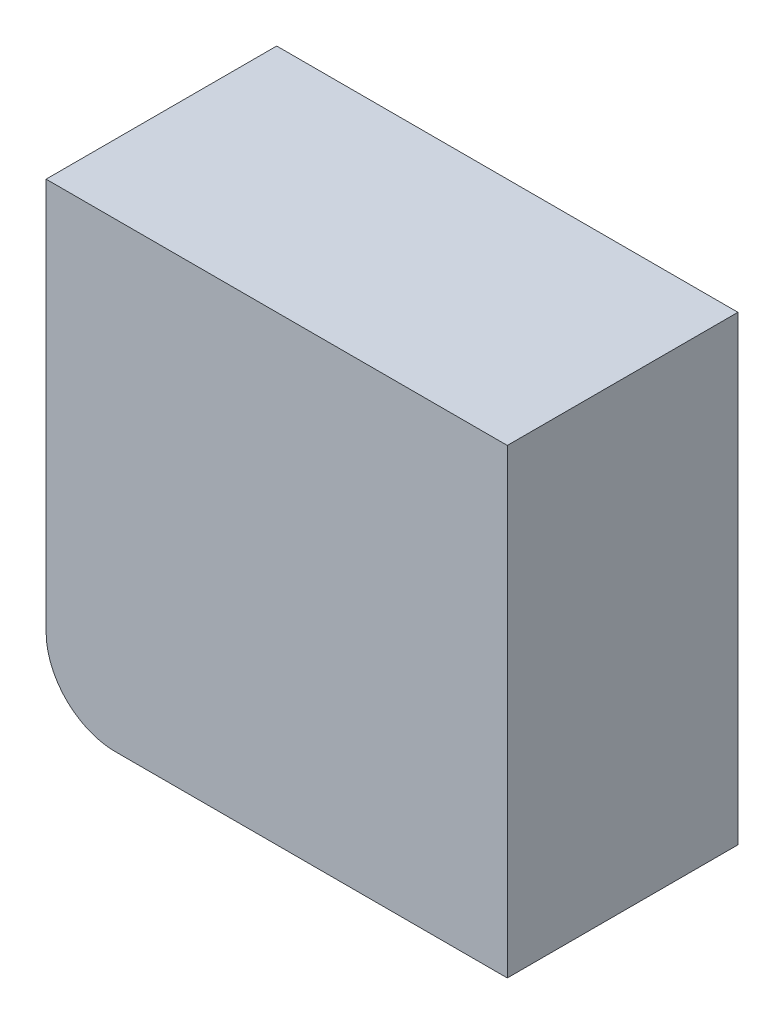
ISO-10303-21;
HEADER;
FILE_DESCRIPTION(('STEP AP214'),'2;1');
FILE_NAME('part.step','',(''),(''),'','','');
FILE_SCHEMA(('AUTOMOTIVE_DESIGN { 1 0 10303 214 1 1 1 1 }'));
ENDSEC;
DATA;
#1=APPLICATION_CONTEXT('core data for automotive mechanical design processes');
#2=APPLICATION_PROTOCOL_DEFINITION('international standard','automotive_design',2000,#1);
#3=PRODUCT_CONTEXT('',#1,'mechanical');
#4=PRODUCT('Part','Part','',(#3));
#5=PRODUCT_RELATED_PRODUCT_CATEGORY('part','',(#4));
#6=PRODUCT_DEFINITION_FORMATION('','',#4);
#7=PRODUCT_DEFINITION_CONTEXT('part definition',#1,'design');
#8=PRODUCT_DEFINITION('design','',#6,#7);
#9=PRODUCT_DEFINITION_SHAPE('','',#8);
#10=(LENGTH_UNIT() NAMED_UNIT(*) SI_UNIT(.MILLI.,.METRE.));
#11=(NAMED_UNIT(*) PLANE_ANGLE_UNIT() SI_UNIT($,.RADIAN.));
#12=(NAMED_UNIT(*) SI_UNIT($,.STERADIAN.) SOLID_ANGLE_UNIT());
#13=UNCERTAINTY_MEASURE_WITH_UNIT(LENGTH_MEASURE(1.E-05),#10,'distance_accuracy_value','');
#14=(GEOMETRIC_REPRESENTATION_CONTEXT(3) GLOBAL_UNCERTAINTY_ASSIGNED_CONTEXT((#13)) GLOBAL_UNIT_ASSIGNED_CONTEXT((#10,
#11,#12)) REPRESENTATION_CONTEXT('',''));
#15=CARTESIAN_POINT('',(0.,0.,0.));
#16=DIRECTION('',(0.,0.,1.));
#17=DIRECTION('',(1.,0.,0.));
#18=AXIS2_PLACEMENT_3D('',#15,#16,#17);
#19=CARTESIAN_POINT('',(0.,0.,10.));
#20=DIRECTION('',(1.,0.,0.));
#21=DIRECTION('',(0.,0.,-1.));
#22=AXIS2_PLACEMENT_3D('',#19,#20,#21);
#23=PLANE('',#22);
#24=DIRECTION('',(0.,-1.,0.));
#25=VECTOR('',#24,1.);
#26=CARTESIAN_POINT('',(0.,0.,0.));
#27=LINE('',#26,#25);
#28=CARTESIAN_POINT('',(0.,20.,0.));
#29=VERTEX_POINT('',#28);
#30=CARTESIAN_POINT('',(0.,5.,0.));
#31=VERTEX_POINT('',#30);
#32=EDGE_CURVE('E129',#29,#31,#27,.T.);
#33=ORIENTED_EDGE('',*,*,#32,.T.);
#34=CARTESIAN_POINT('',(0.,0.,25.));
#35=CARTESIAN_POINT('',(0.,1.,20.));
#36=CARTESIAN_POINT('',(0.,2.,15.));
#37=CARTESIAN_POINT('',(0.,3.,10.));
#38=CARTESIAN_POINT('',(0.,3.66666666666667,6.66666666666667));
#39=CARTESIAN_POINT('',(0.,4.33333333333333,3.33333333333333));
#40=CARTESIAN_POINT('',(0.,5.,0.));
#41=CARTESIAN_POINT('',(0.,6.33333333333333,-6.66666666666667));
#42=CARTESIAN_POINT('',(0.,7.66666666666667,-13.3333333333333));
#43=CARTESIAN_POINT('',(0.,9.,-20.));
#44=(BOUNDED_CURVE() B_SPLINE_CURVE(3,(#34,#35,#36,#37,#38,#39,#40,#41,#42,#43),.UNSPECIFIED.,
.F.,.F.) B_SPLINE_CURVE_WITH_KNOTS((4,3,3,4),(-0.015,0.,0.01,0.03),
.UNSPECIFIED.) CURVE() GEOMETRIC_REPRESENTATION_ITEM() RATIONAL_B_SPLINE_CURVE((1.,1.,1.,1.,1.,
1.,1.,1.,1.,1.)) REPRESENTATION_ITEM(''));
#45=CARTESIAN_POINT('',(0.,3.,10.));
#46=VERTEX_POINT('',#45);
#47=EDGE_CURVE('E63',#31,#46,#44,.F.);
#48=ORIENTED_EDGE('',*,*,#47,.T.);
#49=DIRECTION('',(0.,-1.,0.));
#50=VECTOR('',#49,1.);
#51=CARTESIAN_POINT('',(0.,0.,10.));
#52=LINE('',#51,#50);
#53=CARTESIAN_POINT('',(0.,20.,10.));
#54=VERTEX_POINT('',#53);
#55=EDGE_CURVE('E108',#54,#46,#52,.T.);
#56=ORIENTED_EDGE('',*,*,#55,.F.);
#57=DIRECTION('',(0.,0.,-1.));
#58=VECTOR('',#57,1.);
#59=CARTESIAN_POINT('',(0.,20.,10.));
#60=LINE('',#59,#58);
#61=EDGE_CURVE('E121',#54,#29,#60,.T.);
#62=ORIENTED_EDGE('',*,*,#61,.T.);
#63=EDGE_LOOP('',(#33,#48,#56,#62));
#64=FACE_BOUND('',#63,.T.);
#65=ADVANCED_FACE('F42',(#64),#23,.F.);
#66=CARTESIAN_POINT('',(0.,0.,10.));
#67=DIRECTION('',(0.,1.,0.));
#68=DIRECTION('',(0.,0.,1.));
#69=AXIS2_PLACEMENT_3D('',#66,#67,#68);
#70=PLANE('',#69);
#71=DIRECTION('',(1.,0.,0.));
#72=VECTOR('',#71,1.);
#73=CARTESIAN_POINT('',(0.,0.,10.));
#74=LINE('',#73,#72);
#75=CARTESIAN_POINT('',(3.,0.,10.));
#76=VERTEX_POINT('',#75);
#77=CARTESIAN_POINT('',(20.,0.,10.));
#78=VERTEX_POINT('',#77);
#79=EDGE_CURVE('E97',#76,#78,#74,.T.);
#80=ORIENTED_EDGE('',*,*,#79,.F.);
#81=CARTESIAN_POINT('',(0.,0.,25.));
#82=CARTESIAN_POINT('',(1.,0.,20.));
#83=CARTESIAN_POINT('',(2.,0.,15.));
#84=CARTESIAN_POINT('',(3.,0.,10.));
#85=CARTESIAN_POINT('',(3.66666666666667,0.,6.66666666666667));
#86=CARTESIAN_POINT('',(4.33333333333333,0.,3.33333333333333));
#87=CARTESIAN_POINT('',(5.,0.,0.));
#88=CARTESIAN_POINT('',(6.33333333333333,0.,-6.66666666666667));
#89=CARTESIAN_POINT('',(7.66666666666667,0.,-13.3333333333333));
#90=CARTESIAN_POINT('',(9.,0.,-20.));
#91=(BOUNDED_CURVE() B_SPLINE_CURVE(3,(#81,#82,#83,#84,#85,#86,#87,#88,#89,#90),.UNSPECIFIED.,
.F.,.F.) B_SPLINE_CURVE_WITH_KNOTS((4,3,3,4),(-0.015,0.,0.01,0.03),
.UNSPECIFIED.) CURVE() GEOMETRIC_REPRESENTATION_ITEM() RATIONAL_B_SPLINE_CURVE((1.,1.,1.,1.,1.,
1.,1.,1.,1.,1.)) REPRESENTATION_ITEM(''));
#92=CARTESIAN_POINT('',(5.,0.,0.));
#93=VERTEX_POINT('',#92);
#94=EDGE_CURVE('E119',#76,#93,#91,.T.);
#95=ORIENTED_EDGE('',*,*,#94,.T.);
#96=DIRECTION('',(1.,0.,0.));
#97=VECTOR('',#96,1.);
#98=CARTESIAN_POINT('',(0.,0.,0.));
#99=LINE('',#98,#97);
#100=CARTESIAN_POINT('',(20.,0.,0.));
#101=VERTEX_POINT('',#100);
#102=EDGE_CURVE('E111',#93,#101,#99,.T.);
#103=ORIENTED_EDGE('',*,*,#102,.T.);
#104=DIRECTION('',(0.,0.,-1.));
#105=VECTOR('',#104,1.);
#106=CARTESIAN_POINT('',(20.,0.,10.));
#107=LINE('',#106,#105);
#108=EDGE_CURVE('E115',#78,#101,#107,.T.);
#109=ORIENTED_EDGE('',*,*,#108,.F.);
#110=EDGE_LOOP('',(#80,#95,#103,#109));
#111=FACE_BOUND('',#110,.T.);
#112=ADVANCED_FACE('F114',(#111),#70,.F.);
#113=CARTESIAN_POINT('',(20.,0.,10.));
#114=DIRECTION('',(-1.,0.,0.));
#115=DIRECTION('',(0.,0.,1.));
#116=AXIS2_PLACEMENT_3D('',#113,#114,#115);
#117=PLANE('',#116);
#118=DIRECTION('',(0.,1.,0.));
#119=VECTOR('',#118,1.);
#120=CARTESIAN_POINT('',(20.,0.,0.));
#121=LINE('',#120,#119);
#122=CARTESIAN_POINT('',(20.,20.,0.));
#123=VERTEX_POINT('',#122);
#124=EDGE_CURVE('E134',#101,#123,#121,.T.);
#125=ORIENTED_EDGE('',*,*,#124,.T.);
#126=DIRECTION('',(0.,0.,-1.));
#127=VECTOR('',#126,1.);
#128=CARTESIAN_POINT('',(20.,20.,10.));
#129=LINE('',#128,#127);
#130=CARTESIAN_POINT('',(20.,20.,10.));
#131=VERTEX_POINT('',#130);
#132=EDGE_CURVE('E117',#131,#123,#129,.T.);
#133=ORIENTED_EDGE('',*,*,#132,.F.);
#134=DIRECTION('',(0.,1.,0.));
#135=VECTOR('',#134,1.);
#136=CARTESIAN_POINT('',(20.,0.,10.));
#137=LINE('',#136,#135);
#138=EDGE_CURVE('E103',#78,#131,#137,.T.);
#139=ORIENTED_EDGE('',*,*,#138,.F.);
#140=ORIENTED_EDGE('',*,*,#108,.T.);
#141=EDGE_LOOP('',(#125,#133,#139,#140));
#142=FACE_BOUND('',#141,.T.);
#143=ADVANCED_FACE('F116',(#142),#117,.F.);
#144=CARTESIAN_POINT('',(0.,20.,10.));
#145=DIRECTION('',(0.,-1.,0.));
#146=DIRECTION('',(0.,0.,-1.));
#147=AXIS2_PLACEMENT_3D('',#144,#145,#146);
#148=PLANE('',#147);
#149=DIRECTION('',(-1.,0.,0.));
#150=VECTOR('',#149,1.);
#151=CARTESIAN_POINT('',(0.,20.,0.));
#152=LINE('',#151,#150);
#153=EDGE_CURVE('E135',#123,#29,#152,.T.);
#154=ORIENTED_EDGE('',*,*,#153,.T.);
#155=ORIENTED_EDGE('',*,*,#61,.F.);
#156=DIRECTION('',(-1.,0.,0.));
#157=VECTOR('',#156,1.);
#158=CARTESIAN_POINT('',(0.,20.,10.));
#159=LINE('',#158,#157);
#160=EDGE_CURVE('E122',#131,#54,#159,.T.);
#161=ORIENTED_EDGE('',*,*,#160,.F.);
#162=ORIENTED_EDGE('',*,*,#132,.T.);
#163=EDGE_LOOP('',(#154,#155,#161,#162));
#164=FACE_BOUND('',#163,.T.);
#165=ADVANCED_FACE('F160',(#164),#148,.F.);
#166=CARTESIAN_POINT('',(0.,0.,10.));
#167=DIRECTION('',(0.,0.,-1.));
#168=DIRECTION('',(-1.,0.,0.));
#169=AXIS2_PLACEMENT_3D('',#166,#167,#168);
#170=PLANE('',#169);
#171=ORIENTED_EDGE('',*,*,#55,.T.);
#172=CARTESIAN_POINT('',(0.,3.,10.));
#173=CARTESIAN_POINT('',(-8.08512068479187E-06,2.91562013649833,10.));
#174=CARTESIAN_POINT('',(0.0035599516245499,2.8312441052389,10.));
#175=CARTESIAN_POINT('',(0.0177857007461225,2.66309573936865,10.));
#176=CARTESIAN_POINT('',(0.0284430730339614,2.57932337599362,10.));
#177=CARTESIAN_POINT('',(0.0567742285138056,2.41303301905116,10.));
#178=CARTESIAN_POINT('',(0.074442703896953,2.33051412549025,10.));
#179=CARTESIAN_POINT('',(0.116652747337002,2.16727818478174,10.));
#180=CARTESIAN_POINT('',(0.141194231493787,2.08656111565193,10.));
#181=CARTESIAN_POINT('',(0.224929944623922,1.84789145711202,10.));
#182=CARTESIAN_POINT('',(0.294247025076762,1.69335274509183,10.));
#183=CARTESIAN_POINT('',(0.457796261561747,1.3982197896128,10.));
#184=CARTESIAN_POINT('',(0.552024028485741,1.25762309565199,10.));
#185=CARTESIAN_POINT('',(0.762751358266629,0.994221314761601,10.));
#186=CARTESIAN_POINT('',(0.879250703768606,0.87141605422072,10.));
#187=CARTESIAN_POINT('',(1.13123799410192,0.647088707336876,10.));
#188=CARTESIAN_POINT('',(1.2667296491574,0.545570789256994,10.));
#189=CARTESIAN_POINT('',(1.55284733809731,0.366707769393535,10.));
#190=CARTESIAN_POINT('',(1.70347632731553,0.289367400071087,10.));
#191=CARTESIAN_POINT('',(2.01555094289524,0.161113391347137,10.));
#192=CARTESIAN_POINT('',(2.17699017122708,0.110184273862288,10.));
#193=CARTESIAN_POINT('',(2.44951444579392,0.0488546089372678,10.));
#194=CARTESIAN_POINT('',(2.55888510833486,0.0305451981052154,10.));
#195=CARTESIAN_POINT('',(2.77882189915993,0.00611949579744247,10.));
#196=CARTESIAN_POINT('',(2.8893861082811,-1.40815865907261E-05,10.));
#197=CARTESIAN_POINT('',(3.,0.,10.));
#198=B_SPLINE_CURVE_WITH_KNOTS('',3,(#172,#173,#174,#175,#176,#177,#178,#179,#180,#181,#182,
#183,#184,#185,#186,#187,#188,#189,#190,#191,#192,#193,#194,#195,#196,#197),.UNSPECIFIED.,.F.,
.F.,(4,2,2,2,2,2,2,2,2,2,2,2,4),(0.,0.253057267660729,0.506102396573057,0.758956320118767,
1.01180715716335,1.51730545512248,2.02271474671434,2.52811910611937,3.03362233625863,
3.53922445064323,4.04452992552656,4.37657668424518,4.70815170142211),.UNSPECIFIED.);
#199=EDGE_CURVE('E11',#46,#76,#198,.T.);
#200=ORIENTED_EDGE('',*,*,#199,.T.);
#201=ORIENTED_EDGE('',*,*,#79,.T.);
#202=ORIENTED_EDGE('',*,*,#138,.T.);
#203=ORIENTED_EDGE('',*,*,#160,.T.);
#204=EDGE_LOOP('',(#171,#200,#201,#202,#203));
#205=FACE_BOUND('',#204,.T.);
#206=ADVANCED_FACE('F101',(#205),#170,.F.);
#207=CARTESIAN_POINT('',(0.,0.,0.));
#208=DIRECTION('',(0.,0.,-1.));
#209=DIRECTION('',(-1.,0.,0.));
#210=AXIS2_PLACEMENT_3D('',#207,#208,#209);
#211=PLANE('',#210);
#212=ORIENTED_EDGE('',*,*,#102,.F.);
#213=CARTESIAN_POINT('',(5.,0.,0.));
#214=CARTESIAN_POINT('',(4.85936970517742,-1.51223388245326E-05,0.));
#215=CARTESIAN_POINT('',(4.71874158087122,0.0059324291584946,0.));
#216=CARTESIAN_POINT('',(4.43849149354211,0.0296436580864548,0.));
#217=CARTESIAN_POINT('',(4.29886948257885,0.0474067687029346,0.));
#218=CARTESIAN_POINT('',(4.02172450703861,0.0946220684544968,0.));
#219=CARTESIAN_POINT('',(3.88420003610344,0.124065414973503,0.));
#220=CARTESIAN_POINT('',(3.6121204811365,0.194427003679468,0.));
#221=CARTESIAN_POINT('',(3.47756536087895,0.235345105791924,0.));
#222=CARTESIAN_POINT('',(3.21233860408736,0.32838104055567,0.));
#223=CARTESIAN_POINT('',(3.08166815509621,0.380502258723949,0.));
#224=CARTESIAN_POINT('',(2.82513457763799,0.495587607250076,0.));
#225=CARTESIAN_POINT('',(2.69927324398719,0.558555738425913,0.));
#226=CARTESIAN_POINT('',(2.45337138545627,0.694836581028675,0.));
#227=CARTESIAN_POINT('',(2.33332772467033,0.768143634217547,0.));
#228=CARTESIAN_POINT('',(2.09979769094821,0.924636171011585,0.));
#229=CARTESIAN_POINT('',(1.98631374946828,1.00782528308199,0.));
#230=CARTESIAN_POINT('',(1.76679984755262,1.18343536468571,0.));
#231=CARTESIAN_POINT('',(1.66076707057659,1.27585281357763,0.));
#232=CARTESIAN_POINT('',(1.45682343091003,1.46932537623998,0.));
#233=CARTESIAN_POINT('',(1.35891560852813,1.57038369490814,0.));
#234=CARTESIAN_POINT('',(1.17197793453705,1.78037208220911,0.));
#235=CARTESIAN_POINT('',(1.08294659391849,1.88930082529108,0.));
#236=CARTESIAN_POINT('',(0.914346017046085,2.11431072431048,0.));
#237=CARTESIAN_POINT('',(0.834780156936704,2.23039440999207,0.));
#238=CARTESIAN_POINT('',(0.685712065434687,2.46885584595047,0.));
#239=CARTESIAN_POINT('',(0.616209995571493,2.59123369720942,0.));
#240=CARTESIAN_POINT('',(0.487765260662099,2.84140998230169,0.));
#241=CARTESIAN_POINT('',(0.428822640719215,2.96920843928555,0.));
#242=CARTESIAN_POINT('',(0.321941662807114,3.22926041653035,0.));
#243=CARTESIAN_POINT('',(0.27399802584682,3.3615117645147,0.));
#244=CARTESIAN_POINT('',(0.189430662128061,3.62953366520314,0.));
#245=CARTESIAN_POINT('',(0.152804470428591,3.76530344460038,0.));
#246=CARTESIAN_POINT('',(0.0814487389431193,4.08246320865181,0.));
#247=CARTESIAN_POINT('',(0.050906472304118,4.26482253631953,0.));
#248=CARTESIAN_POINT('',(0.0203661859042761,4.53982554565243,0.));
#249=CARTESIAN_POINT('',(0.01273161611543,4.63169050822243,0.));
#250=CARTESIAN_POINT('',(0.00254913612454791,4.81569611489421,0.));
#251=CARTESIAN_POINT('',(9.04024325188174E-07,4.90783674118047,0.));
#252=CARTESIAN_POINT('',(0.,5.,0.));
#253=B_SPLINE_CURVE_WITH_KNOTS('',3,(#213,#214,#215,#216,#217,#218,#219,#220,#221,#222,#223,
#224,#225,#226,#227,#228,#229,#230,#231,#232,#233,#234,#235,#236,#237,#238,#239,#240,#241,#242,
#243,#244,#245,#246,#247,#248,#249,#250,#251,#252),.UNSPECIFIED.,.F.,.F.,(4,2,2,2,2,2,2,2,2,2,2,
2,2,2,2,2,2,2,2,4),(0.,0.421762112767881,0.843503994288427,1.26492720019795,1.68634526193892,
2.10789085328035,2.52959226338591,2.95106377581107,3.37269052404692,3.79415703039286,
4.21578054240964,4.6373332086323,5.05903578615337,5.48074513148569,5.90245627805166,
6.32396459780852,6.7453810481855,7.29879231271653,7.57521919596081,7.85162858446929),.UNSPECIFIED.);
#254=EDGE_CURVE('E73',#93,#31,#253,.T.);
#255=ORIENTED_EDGE('',*,*,#254,.T.);
#256=ORIENTED_EDGE('',*,*,#32,.F.);
#257=ORIENTED_EDGE('',*,*,#153,.F.);
#258=ORIENTED_EDGE('',*,*,#124,.F.);
#259=EDGE_LOOP('',(#212,#255,#256,#257,#258));
#260=FACE_BOUND('',#259,.T.);
#261=ADVANCED_FACE('F155',(#260),#211,.T.);
#262=CARTESIAN_POINT('',(2.6,0.,12.));
#263=CARTESIAN_POINT('',(2.73333333333333,0.,11.3333333333333));
#264=CARTESIAN_POINT('',(2.86666666666667,0.,10.6666666666667));
#265=CARTESIAN_POINT('',(3.,0.,10.));
#266=CARTESIAN_POINT('',(3.66666666666667,0.,6.66666666666667));
#267=CARTESIAN_POINT('',(4.33333333333333,0.,3.33333333333333));
#268=CARTESIAN_POINT('',(5.,0.,0.));
#269=CARTESIAN_POINT('',(5.13333333333333,0.,-0.666666666666668));
#270=CARTESIAN_POINT('',(5.26666666666667,0.,-1.33333333333334));
#271=CARTESIAN_POINT('',(5.4,0.,-2.));
#272=CARTESIAN_POINT('',(0.,0.,12.));
#273=CARTESIAN_POINT('',(0.,0.,11.3333333333333));
#274=CARTESIAN_POINT('',(0.,0.,10.6666666666667));
#275=CARTESIAN_POINT('',(0.,0.,10.));
#276=CARTESIAN_POINT('',(0.,0.,6.66666666666667));
#277=CARTESIAN_POINT('',(0.,0.,3.33333333333333));
#278=CARTESIAN_POINT('',(0.,0.,0.));
#279=CARTESIAN_POINT('',(0.,0.,-0.666666666666668));
#280=CARTESIAN_POINT('',(0.,0.,-1.33333333333334));
#281=CARTESIAN_POINT('',(0.,0.,-2.00000000000001));
#282=CARTESIAN_POINT('',(0.,2.6,12.));
#283=CARTESIAN_POINT('',(0.,2.73333333333333,11.3333333333333));
#284=CARTESIAN_POINT('',(0.,2.86666666666667,10.6666666666667));
#285=CARTESIAN_POINT('',(0.,3.,10.));
#286=CARTESIAN_POINT('',(0.,3.66666666666667,6.66666666666667));
#287=CARTESIAN_POINT('',(0.,4.33333333333333,3.33333333333333));
#288=CARTESIAN_POINT('',(0.,5.,0.));
#289=CARTESIAN_POINT('',(0.,5.13333333333333,-0.666666666666668));
#290=CARTESIAN_POINT('',(0.,5.26666666666667,-1.33333333333334));
#291=CARTESIAN_POINT('',(0.,5.4,-2.));
#292=(BOUNDED_SURFACE() B_SPLINE_SURFACE(2,3,((#262,#263,#264,#265,#266,#267,#268,#269,#270,
#271),(#272,#273,#274,#275,#276,#277,#278,#279,#280,#281),(#282,#283,#284,#285,#286,#287,#288,
#289,#290,#291)),.UNSPECIFIED.,.F.,.F.,.F.) B_SPLINE_SURFACE_WITH_KNOTS((3,3),(4,3,3,4),(0.,1.),
(-0.002,0.,0.01,0.012),
.UNSPECIFIED.) GEOMETRIC_REPRESENTATION_ITEM() RATIONAL_B_SPLINE_SURFACE(((1.,1.,1.,1.,1.,1.,1.,
1.,1.,1.),(0.707106781186548,0.707106781186548,0.707106781186548,0.707106781186548,
0.707106781186548,0.707106781186548,0.707106781186548,0.707106781186548,0.707106781186548,
0.707106781186548),(1.,1.,1.,1.,1.,1.,1.,1.,1.,1.))) REPRESENTATION_ITEM('') SURFACE());
#293=ORIENTED_EDGE('',*,*,#199,.F.);
#294=ORIENTED_EDGE('',*,*,#47,.F.);
#295=ORIENTED_EDGE('',*,*,#254,.F.);
#296=ORIENTED_EDGE('',*,*,#94,.F.);
#297=EDGE_LOOP('',(#293,#294,#295,#296));
#298=FACE_BOUND('',#297,.T.);
#299=ADVANCED_FACE('F50',(#298),#292,.T.);
#300=CLOSED_SHELL('',(#65,#112,#143,#165,#206,#261,#299));
#301=MANIFOLD_SOLID_BREP('B2',#300);
#302=ADVANCED_BREP_SHAPE_REPRESENTATION('',(#18,#301),#14);
#303=SHAPE_DEFINITION_REPRESENTATION(#9,#302);
ENDSEC;
END-ISO-10303-21;
